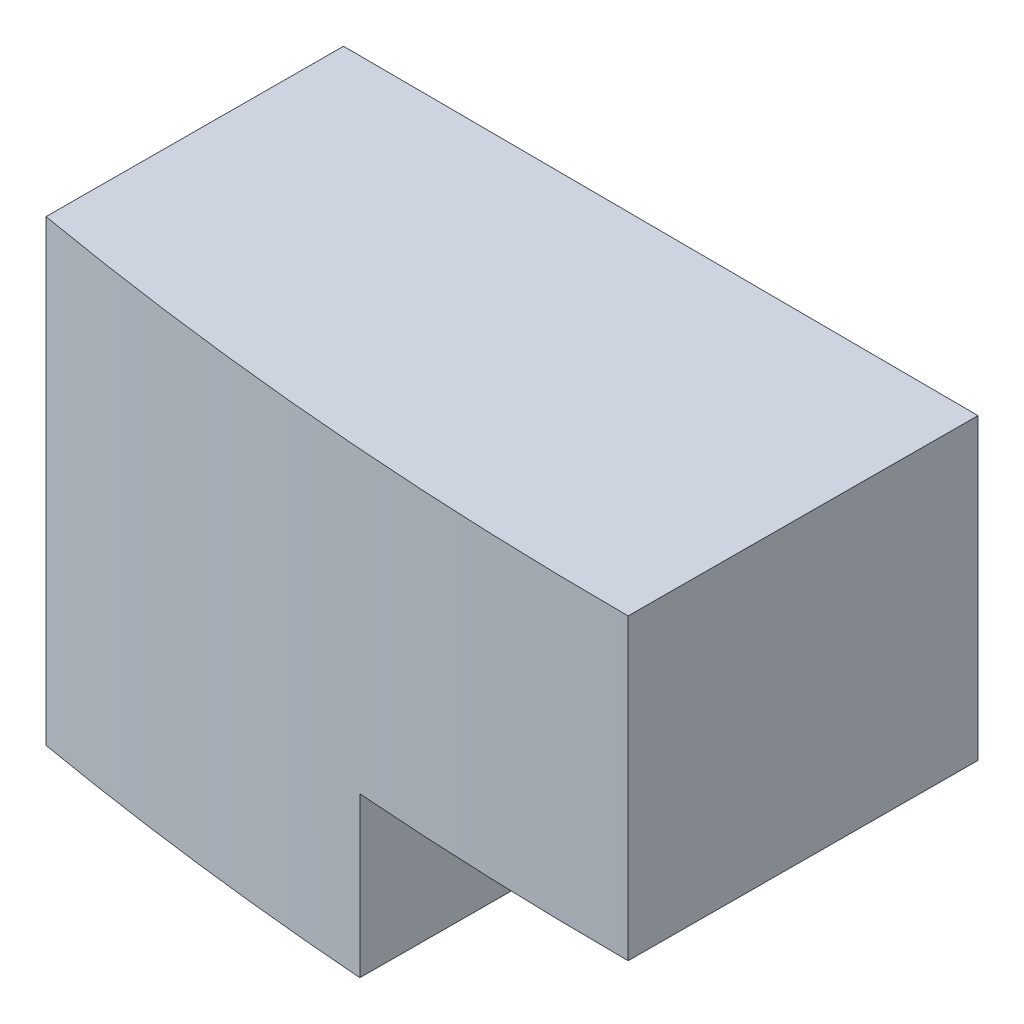
ISO-10303-21;
HEADER;
FILE_DESCRIPTION(('STEP AP214'),'2;1');
FILE_NAME('part.step','',(''),(''),'','','');
FILE_SCHEMA(('AUTOMOTIVE_DESIGN { 1 0 10303 214 1 1 1 1 }'));
ENDSEC;
DATA;
#1=APPLICATION_CONTEXT('core data for automotive mechanical design processes');
#2=APPLICATION_PROTOCOL_DEFINITION('international standard','automotive_design',2000,#1);
#3=PRODUCT_CONTEXT('',#1,'mechanical');
#4=PRODUCT('Part','Part','',(#3));
#5=PRODUCT_RELATED_PRODUCT_CATEGORY('part','',(#4));
#6=PRODUCT_DEFINITION_FORMATION('','',#4);
#7=PRODUCT_DEFINITION_CONTEXT('part definition',#1,'design');
#8=PRODUCT_DEFINITION('design','',#6,#7);
#9=PRODUCT_DEFINITION_SHAPE('','',#8);
#10=(LENGTH_UNIT() NAMED_UNIT(*) SI_UNIT(.MILLI.,.METRE.));
#11=(NAMED_UNIT(*) PLANE_ANGLE_UNIT() SI_UNIT($,.RADIAN.));
#12=(NAMED_UNIT(*) SI_UNIT($,.STERADIAN.) SOLID_ANGLE_UNIT());
#13=UNCERTAINTY_MEASURE_WITH_UNIT(LENGTH_MEASURE(1.E-05),#10,'distance_accuracy_value','');
#14=(GEOMETRIC_REPRESENTATION_CONTEXT(3) GLOBAL_UNCERTAINTY_ASSIGNED_CONTEXT((#13)) GLOBAL_UNIT_ASSIGNED_CONTEXT((#10,
#11,#12)) REPRESENTATION_CONTEXT('',''));
#15=CARTESIAN_POINT('',(0.,0.,0.));
#16=DIRECTION('',(0.,0.,1.));
#17=DIRECTION('',(1.,0.,0.));
#18=AXIS2_PLACEMENT_3D('',#15,#16,#17);
#19=CARTESIAN_POINT('',(0.,9.2,0.));
#20=DIRECTION('',(0.,-1.,0.));
#21=DIRECTION('',(0.,0.,-1.));
#22=AXIS2_PLACEMENT_3D('',#19,#20,#21);
#23=CYLINDRICAL_SURFACE('',#22,75.);
#24=DIRECTION('',(0.,-1.,0.));
#25=VECTOR('',#24,1.);
#26=CARTESIAN_POINT('',(-5.59917242306802,9.2,74.7907030865251));
#27=LINE('',#26,#25);
#28=CARTESIAN_POINT('',(-5.59917242306802,0.,74.7907030865251));
#29=VERTEX_POINT('',#28);
#30=CARTESIAN_POINT('',(-5.59917242306802,3.2,74.7907030865251));
#31=VERTEX_POINT('',#30);
#32=EDGE_CURVE('E53',#29,#31,#27,.F.);
#33=ORIENTED_EDGE('',*,*,#32,.T.);
#34=CARTESIAN_POINT('',(0.,3.2,0.));
#35=DIRECTION('',(0.,1.,0.));
#36=DIRECTION('',(0.,0.,1.));
#37=AXIS2_PLACEMENT_3D('',#34,#35,#36);
#38=CIRCLE('',#37,75.);
#39=CARTESIAN_POINT('',(0.,3.2,75.));
#40=VERTEX_POINT('',#39);
#41=EDGE_CURVE('E119',#31,#40,#38,.T.);
#42=ORIENTED_EDGE('',*,*,#41,.T.);
#43=DIRECTION('',(0.,-1.,0.));
#44=VECTOR('',#43,1.);
#45=CARTESIAN_POINT('',(0.,9.2,75.));
#46=LINE('',#45,#44);
#47=CARTESIAN_POINT('',(0.,9.2,75.));
#48=VERTEX_POINT('',#47);
#49=EDGE_CURVE('E46',#48,#40,#46,.T.);
#50=ORIENTED_EDGE('',*,*,#49,.F.);
#51=CARTESIAN_POINT('',(0.,9.2,0.));
#52=DIRECTION('',(0.,1.,0.));
#53=DIRECTION('',(0.,0.,1.));
#54=AXIS2_PLACEMENT_3D('',#51,#52,#53);
#55=CIRCLE('',#54,75.);
#56=CARTESIAN_POINT('',(-12.7955064414011,9.2,73.9004398830485));
#57=VERTEX_POINT('',#56);
#58=EDGE_CURVE('E117',#57,#48,#55,.T.);
#59=ORIENTED_EDGE('',*,*,#58,.F.);
#60=DIRECTION('',(0.,-1.,0.));
#61=VECTOR('',#60,1.);
#62=CARTESIAN_POINT('',(-12.7955064414011,9.2,73.9004398830485));
#63=LINE('',#62,#61);
#64=CARTESIAN_POINT('',(-12.7955064414011,0.,73.9004398830485));
#65=VERTEX_POINT('',#64);
#66=EDGE_CURVE('E123',#57,#65,#63,.T.);
#67=ORIENTED_EDGE('',*,*,#66,.T.);
#68=CARTESIAN_POINT('',(0.,0.,0.));
#69=DIRECTION('',(0.,1.,0.));
#70=DIRECTION('',(0.,0.,1.));
#71=AXIS2_PLACEMENT_3D('',#68,#69,#70);
#72=CIRCLE('',#71,75.);
#73=EDGE_CURVE('E115',#65,#29,#72,.T.);
#74=ORIENTED_EDGE('',*,*,#73,.T.);
#75=EDGE_LOOP('',(#33,#42,#50,#59,#67,#74));
#76=FACE_BOUND('',#75,.T.);
#77=ADVANCED_FACE('F39',(#76),#23,.T.);
#78=CARTESIAN_POINT('',(0.,9.2,75.));
#79=DIRECTION('',(-0.999991227031138,0.,-0.00418877795539671));
#80=DIRECTION('',(-0.00418877795539671,0.,0.999991227031138));
#81=AXIS2_PLACEMENT_3D('',#78,#79,#80);
#82=PLANE('',#81);
#83=ORIENTED_EDGE('',*,*,#49,.T.);
#84=DIRECTION('',(0.00418877795539674,0.,-0.999991227031138));
#85=VECTOR('',#84,1.);
#86=CARTESIAN_POINT('',(-0.000224508174360559,3.2,75.0535970651004));
#87=LINE('',#86,#85);
#88=CARTESIAN_POINT('',(0.0293217029261729,3.2,68.));
#89=VERTEX_POINT('',#88);
#90=EDGE_CURVE('E131',#40,#89,#87,.T.);
#91=ORIENTED_EDGE('',*,*,#90,.T.);
#92=DIRECTION('',(0.,-1.,0.));
#93=VECTOR('',#92,1.);
#94=CARTESIAN_POINT('',(0.029321702926173,9.2,68.));
#95=LINE('',#94,#93);
#96=CARTESIAN_POINT('',(0.029321702926173,9.2,68.));
#97=VERTEX_POINT('',#96);
#98=EDGE_CURVE('E127',#97,#89,#95,.T.);
#99=ORIENTED_EDGE('',*,*,#98,.F.);
#100=DIRECTION('',(0.00418877795539671,0.,-0.999991227031138));
#101=VECTOR('',#100,1.);
#102=CARTESIAN_POINT('',(0.,9.2,75.));
#103=LINE('',#102,#101);
#104=EDGE_CURVE('E84',#48,#97,#103,.T.);
#105=ORIENTED_EDGE('',*,*,#104,.F.);
#106=EDGE_LOOP('',(#83,#91,#99,#105));
#107=FACE_BOUND('',#106,.T.);
#108=ADVANCED_FACE('F130',(#107),#82,.F.);
#109=CARTESIAN_POINT('',(0.029321702926173,9.2,68.));
#110=DIRECTION('',(-0.00418877795539674,0.,0.999991227031138));
#111=DIRECTION('',(0.999991227031138,0.,0.00418877795539674));
#112=AXIS2_PLACEMENT_3D('',#109,#110,#111);
#113=PLANE('',#112);
#114=ORIENTED_EDGE('',*,*,#98,.T.);
#115=DIRECTION('',(0.999991227031138,0.,0.00418877795539674));
#116=VECTOR('',#115,1.);
#117=CARTESIAN_POINT('',(0.0293217029261729,3.2,68.));
#118=LINE('',#117,#116);
#119=CARTESIAN_POINT('',(-5.5706291684482,3.2,67.9765428434498));
#120=VERTEX_POINT('',#119);
#121=EDGE_CURVE('E112',#120,#89,#118,.T.);
#122=ORIENTED_EDGE('',*,*,#121,.F.);
#123=DIRECTION('',(0.,1.,0.));
#124=VECTOR('',#123,1.);
#125=CARTESIAN_POINT('',(-5.5706291684482,3.2,67.9765428434498));
#126=LINE('',#125,#124);
#127=CARTESIAN_POINT('',(-5.5706291684482,0.,67.9765428434498));
#128=VERTEX_POINT('',#127);
#129=EDGE_CURVE('E101',#128,#120,#126,.T.);
#130=ORIENTED_EDGE('',*,*,#129,.F.);
#131=DIRECTION('',(-0.999991227031138,0.,-0.00418877795539674));
#132=VECTOR('',#131,1.);
#133=CARTESIAN_POINT('',(0.029321702926173,0.,68.));
#134=LINE('',#133,#132);
#135=CARTESIAN_POINT('',(-12.7705660030724,0.,67.9463836421709));
#136=VERTEX_POINT('',#135);
#137=EDGE_CURVE('E111',#128,#136,#134,.T.);
#138=ORIENTED_EDGE('',*,*,#137,.T.);
#139=DIRECTION('',(0.,-1.,0.));
#140=VECTOR('',#139,1.);
#141=CARTESIAN_POINT('',(-12.7705660030724,9.2,67.9463836421709));
#142=LINE('',#141,#140);
#143=CARTESIAN_POINT('',(-12.7705660030724,9.2,67.9463836421709));
#144=VERTEX_POINT('',#143);
#145=EDGE_CURVE('E125',#144,#136,#142,.T.);
#146=ORIENTED_EDGE('',*,*,#145,.F.);
#147=DIRECTION('',(-0.999991227031138,0.,-0.00418877795539674));
#148=VECTOR('',#147,1.);
#149=CARTESIAN_POINT('',(0.029321702926173,9.2,68.));
#150=LINE('',#149,#148);
#151=EDGE_CURVE('E142',#97,#144,#150,.T.);
#152=ORIENTED_EDGE('',*,*,#151,.F.);
#153=EDGE_LOOP('',(#114,#122,#130,#138,#146,#152));
#154=FACE_BOUND('',#153,.T.);
#155=ADVANCED_FACE('F109',(#154),#113,.F.);
#156=CARTESIAN_POINT('',(-12.7705660030724,9.2,67.9463836421709));
#157=DIRECTION('',(0.999991227031138,0.,0.00418877795539592));
#158=DIRECTION('',(0.00418877795539592,0.,-0.999991227031138));
#159=AXIS2_PLACEMENT_3D('',#156,#157,#158);
#160=PLANE('',#159);
#161=DIRECTION('',(-0.00418877795539592,0.,0.999991227031138));
#162=VECTOR('',#161,1.);
#163=CARTESIAN_POINT('',(-12.7705660030724,0.,67.9463836421709));
#164=LINE('',#163,#162);
#165=EDGE_CURVE('E76',#136,#65,#164,.T.);
#166=ORIENTED_EDGE('',*,*,#165,.T.);
#167=ORIENTED_EDGE('',*,*,#66,.F.);
#168=DIRECTION('',(-0.00418877795539592,0.,0.999991227031138));
#169=VECTOR('',#168,1.);
#170=CARTESIAN_POINT('',(-12.7705660030724,9.2,67.9463836421709));
#171=LINE('',#170,#169);
#172=EDGE_CURVE('E61',#144,#57,#171,.T.);
#173=ORIENTED_EDGE('',*,*,#172,.F.);
#174=ORIENTED_EDGE('',*,*,#145,.T.);
#175=EDGE_LOOP('',(#166,#167,#173,#174));
#176=FACE_BOUND('',#175,.T.);
#177=ADVANCED_FACE('F145',(#176),#160,.F.);
#178=CARTESIAN_POINT('',(0.,9.2,0.));
#179=DIRECTION('',(0.,1.,0.));
#180=DIRECTION('',(0.,0.,1.));
#181=AXIS2_PLACEMENT_3D('',#178,#179,#180);
#182=PLANE('',#181);
#183=ORIENTED_EDGE('',*,*,#58,.T.);
#184=ORIENTED_EDGE('',*,*,#104,.T.);
#185=ORIENTED_EDGE('',*,*,#151,.T.);
#186=ORIENTED_EDGE('',*,*,#172,.T.);
#187=EDGE_LOOP('',(#183,#184,#185,#186));
#188=FACE_BOUND('',#187,.T.);
#189=ADVANCED_FACE('F144',(#188),#182,.T.);
#190=CARTESIAN_POINT('',(0.,0.,0.));
#191=DIRECTION('',(0.,1.,0.));
#192=DIRECTION('',(0.,0.,1.));
#193=AXIS2_PLACEMENT_3D('',#190,#191,#192);
#194=PLANE('',#193);
#195=ORIENTED_EDGE('',*,*,#137,.F.);
#196=DIRECTION('',(-0.00418877795539674,0.,0.999991227031138));
#197=VECTOR('',#196,1.);
#198=CARTESIAN_POINT('',(-5.285795280821,0.,-0.0221412169932504));
#199=LINE('',#198,#197);
#200=EDGE_CURVE('E11',#128,#29,#199,.T.);
#201=ORIENTED_EDGE('',*,*,#200,.T.);
#202=ORIENTED_EDGE('',*,*,#73,.F.);
#203=ORIENTED_EDGE('',*,*,#165,.F.);
#204=EDGE_LOOP('',(#195,#201,#202,#203));
#205=FACE_BOUND('',#204,.T.);
#206=ADVANCED_FACE('F114',(#205),#194,.F.);
#207=CARTESIAN_POINT('',(-0.000224508174360559,3.2,75.0535970651004));
#208=DIRECTION('',(0.,1.,0.));
#209=DIRECTION('',(0.,0.,1.));
#210=AXIS2_PLACEMENT_3D('',#207,#208,#209);
#211=PLANE('',#210);
#212=DIRECTION('',(0.00418877795539674,0.,-0.999991227031138));
#213=VECTOR('',#212,1.);
#214=CARTESIAN_POINT('',(-5.60017537954873,3.2,75.0301399085502));
#215=LINE('',#214,#213);
#216=EDGE_CURVE('E195',#31,#120,#215,.T.);
#217=ORIENTED_EDGE('',*,*,#216,.T.);
#218=ORIENTED_EDGE('',*,*,#121,.T.);
#219=ORIENTED_EDGE('',*,*,#90,.F.);
#220=ORIENTED_EDGE('',*,*,#41,.F.);
#221=EDGE_LOOP('',(#217,#218,#219,#220));
#222=FACE_BOUND('',#221,.T.);
#223=ADVANCED_FACE('F175',(#222),#211,.F.);
#224=CARTESIAN_POINT('',(-5.60017537954873,3.2,75.0301399085502));
#225=DIRECTION('',(-0.999991227031138,0.,-0.00418877795539674));
#226=DIRECTION('',(-0.00418877795539674,0.,0.999991227031138));
#227=AXIS2_PLACEMENT_3D('',#224,#225,#226);
#228=PLANE('',#227);
#229=ORIENTED_EDGE('',*,*,#200,.F.);
#230=ORIENTED_EDGE('',*,*,#129,.T.);
#231=ORIENTED_EDGE('',*,*,#216,.F.);
#232=ORIENTED_EDGE('',*,*,#32,.F.);
#233=EDGE_LOOP('',(#229,#230,#231,#232));
#234=FACE_BOUND('',#233,.T.);
#235=ADVANCED_FACE('F100',(#234),#228,.F.);
#236=CLOSED_SHELL('',(#77,#108,#155,#177,#189,#206,#223,#235));
#237=MANIFOLD_SOLID_BREP('B2',#236);
#238=ADVANCED_BREP_SHAPE_REPRESENTATION('',(#18,#237),#14);
#239=SHAPE_DEFINITION_REPRESENTATION(#9,#238);
ENDSEC;
END-ISO-10303-21;
